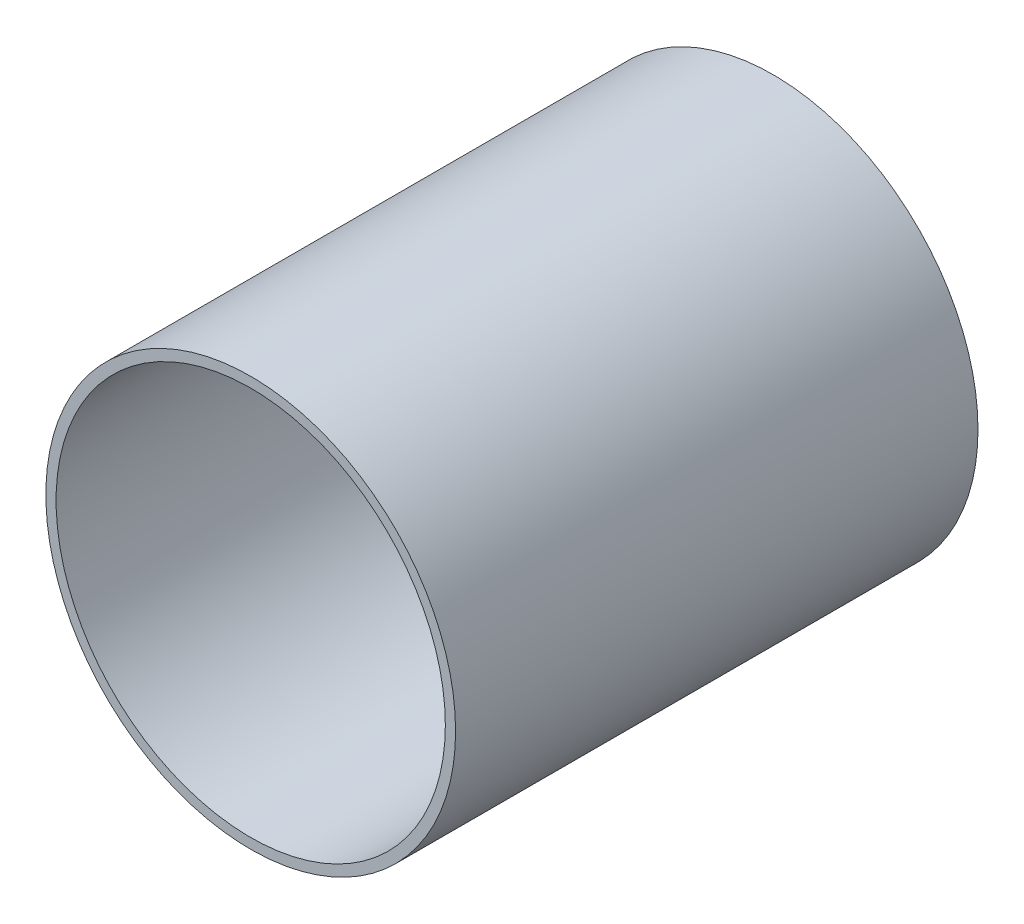
ISO-10303-21;
HEADER;
FILE_DESCRIPTION(('STEP AP214'),'2;1');
FILE_NAME('part.step','',(''),(''),'','','');
FILE_SCHEMA(('AUTOMOTIVE_DESIGN { 1 0 10303 214 1 1 1 1 }'));
ENDSEC;
DATA;
#1=APPLICATION_CONTEXT('core data for automotive mechanical design processes');
#2=APPLICATION_PROTOCOL_DEFINITION('international standard','automotive_design',2000,#1);
#3=PRODUCT_CONTEXT('',#1,'mechanical');
#4=PRODUCT('Part','Part','',(#3));
#5=PRODUCT_RELATED_PRODUCT_CATEGORY('part','',(#4));
#6=PRODUCT_DEFINITION_FORMATION('','',#4);
#7=PRODUCT_DEFINITION_CONTEXT('part definition',#1,'design');
#8=PRODUCT_DEFINITION('design','',#6,#7);
#9=PRODUCT_DEFINITION_SHAPE('','',#8);
#10=(LENGTH_UNIT() NAMED_UNIT(*) SI_UNIT(.MILLI.,.METRE.));
#11=(NAMED_UNIT(*) PLANE_ANGLE_UNIT() SI_UNIT($,.RADIAN.));
#12=(NAMED_UNIT(*) SI_UNIT($,.STERADIAN.) SOLID_ANGLE_UNIT());
#13=UNCERTAINTY_MEASURE_WITH_UNIT(LENGTH_MEASURE(1.E-05),#10,'distance_accuracy_value','');
#14=(GEOMETRIC_REPRESENTATION_CONTEXT(3) GLOBAL_UNCERTAINTY_ASSIGNED_CONTEXT((#13)) GLOBAL_UNIT_ASSIGNED_CONTEXT((#10,
#11,#12)) REPRESENTATION_CONTEXT('',''));
#15=CARTESIAN_POINT('',(0.,0.,0.));
#16=DIRECTION('',(0.,0.,1.));
#17=DIRECTION('',(1.,0.,0.));
#18=AXIS2_PLACEMENT_3D('',#15,#16,#17);
#19=CARTESIAN_POINT('',(0.,0.,25.5));
#20=DIRECTION('',(0.,0.,1.));
#21=DIRECTION('',(1.,0.,0.));
#22=AXIS2_PLACEMENT_3D('',#19,#20,#21);
#23=PLANE('',#22);
#24=CARTESIAN_POINT('',(0.,0.,25.5));
#25=DIRECTION('',(0.,0.,1.));
#26=DIRECTION('',(1.,0.,0.));
#27=AXIS2_PLACEMENT_3D('',#24,#25,#26);
#28=CIRCLE('',#27,10.);
#29=CARTESIAN_POINT('',(10.,0.,25.5));
#30=VERTEX_POINT('',#29);
#31=EDGE_CURVE('E10',#30,#30,#28,.T.);
#32=ORIENTED_EDGE('',*,*,#31,.T.);
#33=EDGE_LOOP('',(#32));
#34=FACE_BOUND('',#33,.T.);
#35=CARTESIAN_POINT('',(0.,0.,25.5));
#36=DIRECTION('',(0.,0.,1.));
#37=DIRECTION('',(1.,0.,0.));
#38=AXIS2_PLACEMENT_3D('',#35,#36,#37);
#39=CIRCLE('',#38,9.5);
#40=CARTESIAN_POINT('',(9.5,0.,25.5));
#41=VERTEX_POINT('',#40);
#42=EDGE_CURVE('E43',#41,#41,#39,.T.);
#43=ORIENTED_EDGE('',*,*,#42,.F.);
#44=EDGE_LOOP('',(#43));
#45=FACE_BOUND('',#44,.T.);
#46=ADVANCED_FACE('F32',(#34,#45),#23,.T.);
#47=CARTESIAN_POINT('',(0.,0.,0.));
#48=DIRECTION('',(0.,0.,1.));
#49=DIRECTION('',(1.,0.,0.));
#50=AXIS2_PLACEMENT_3D('',#47,#48,#49);
#51=PLANE('',#50);
#52=CARTESIAN_POINT('',(0.,0.,0.));
#53=DIRECTION('',(0.,0.,1.));
#54=DIRECTION('',(1.,0.,0.));
#55=AXIS2_PLACEMENT_3D('',#52,#53,#54);
#56=CIRCLE('',#55,10.);
#57=CARTESIAN_POINT('',(10.,0.,0.));
#58=VERTEX_POINT('',#57);
#59=EDGE_CURVE('E36',#58,#58,#56,.T.);
#60=ORIENTED_EDGE('',*,*,#59,.F.);
#61=EDGE_LOOP('',(#60));
#62=FACE_BOUND('',#61,.T.);
#63=CARTESIAN_POINT('',(0.,0.,0.));
#64=DIRECTION('',(0.,0.,1.));
#65=DIRECTION('',(1.,0.,0.));
#66=AXIS2_PLACEMENT_3D('',#63,#64,#65);
#67=CIRCLE('',#66,9.5);
#68=CARTESIAN_POINT('',(9.5,0.,0.));
#69=VERTEX_POINT('',#68);
#70=EDGE_CURVE('E45',#69,#69,#67,.T.);
#71=ORIENTED_EDGE('',*,*,#70,.T.);
#72=EDGE_LOOP('',(#71));
#73=FACE_BOUND('',#72,.T.);
#74=ADVANCED_FACE('F55',(#62,#73),#51,.F.);
#75=CARTESIAN_POINT('',(0.,0.,25.5));
#76=DIRECTION('',(0.,0.,-1.));
#77=DIRECTION('',(-1.,0.,0.));
#78=AXIS2_PLACEMENT_3D('',#75,#76,#77);
#79=CYLINDRICAL_SURFACE('',#78,10.);
#80=ORIENTED_EDGE('',*,*,#31,.F.);
#81=EDGE_LOOP('',(#80));
#82=FACE_BOUND('',#81,.T.);
#83=ORIENTED_EDGE('',*,*,#59,.T.);
#84=EDGE_LOOP('',(#83));
#85=FACE_BOUND('',#84,.T.);
#86=ADVANCED_FACE('F34',(#82,#85),#79,.T.);
#87=CARTESIAN_POINT('',(0.,0.,25.5));
#88=DIRECTION('',(0.,0.,-1.));
#89=DIRECTION('',(-1.,0.,0.));
#90=AXIS2_PLACEMENT_3D('',#87,#88,#89);
#91=CYLINDRICAL_SURFACE('',#90,9.5);
#92=ORIENTED_EDGE('',*,*,#42,.T.);
#93=EDGE_LOOP('',(#92));
#94=FACE_BOUND('',#93,.T.);
#95=ORIENTED_EDGE('',*,*,#70,.F.);
#96=EDGE_LOOP('',(#95));
#97=FACE_BOUND('',#96,.T.);
#98=ADVANCED_FACE('F51',(#94,#97),#91,.F.);
#99=CLOSED_SHELL('',(#46,#74,#86,#98));
#100=MANIFOLD_SOLID_BREP('B2',#99);
#101=ADVANCED_BREP_SHAPE_REPRESENTATION('',(#18,#100),#14);
#102=SHAPE_DEFINITION_REPRESENTATION(#9,#101);
ENDSEC;
END-ISO-10303-21;
